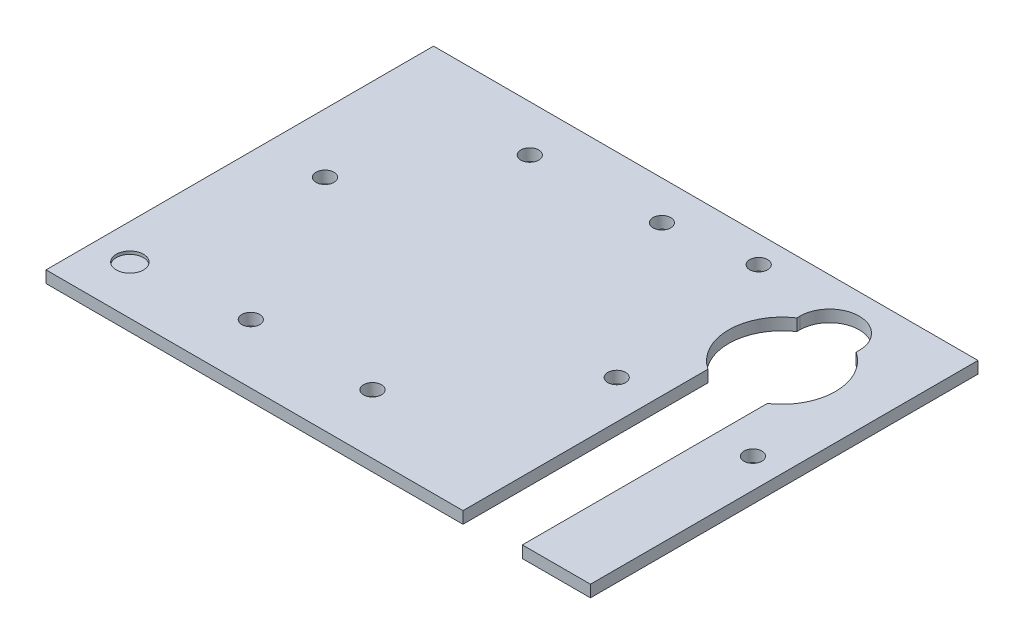
ISO-10303-21;
HEADER;
FILE_DESCRIPTION(('STEP AP214'),'2;1');
FILE_NAME('part.step','',(''),(''),'','','');
FILE_SCHEMA(('AUTOMOTIVE_DESIGN { 1 0 10303 214 1 1 1 1 }'));
ENDSEC;
DATA;
#1=APPLICATION_CONTEXT('core data for automotive mechanical design processes');
#2=APPLICATION_PROTOCOL_DEFINITION('international standard','automotive_design',2000,#1);
#3=PRODUCT_CONTEXT('',#1,'mechanical');
#4=PRODUCT('Part','Part','',(#3));
#5=PRODUCT_RELATED_PRODUCT_CATEGORY('part','',(#4));
#6=PRODUCT_DEFINITION_FORMATION('','',#4);
#7=PRODUCT_DEFINITION_CONTEXT('part definition',#1,'design');
#8=PRODUCT_DEFINITION('design','',#6,#7);
#9=PRODUCT_DEFINITION_SHAPE('','',#8);
#10=(LENGTH_UNIT() NAMED_UNIT(*) SI_UNIT(.MILLI.,.METRE.));
#11=(NAMED_UNIT(*) PLANE_ANGLE_UNIT() SI_UNIT($,.RADIAN.));
#12=(NAMED_UNIT(*) SI_UNIT($,.STERADIAN.) SOLID_ANGLE_UNIT());
#13=UNCERTAINTY_MEASURE_WITH_UNIT(LENGTH_MEASURE(1.E-05),#10,'distance_accuracy_value','');
#14=(GEOMETRIC_REPRESENTATION_CONTEXT(3) GLOBAL_UNCERTAINTY_ASSIGNED_CONTEXT((#13)) GLOBAL_UNIT_ASSIGNED_CONTEXT((#10,
#11,#12)) REPRESENTATION_CONTEXT('',''));
#15=CARTESIAN_POINT('',(0.,0.,0.));
#16=DIRECTION('',(0.,0.,1.));
#17=DIRECTION('',(1.,0.,0.));
#18=AXIS2_PLACEMENT_3D('',#15,#16,#17);
#19=CARTESIAN_POINT('',(184.512742249768,85.7958597408411,32.9410488586266));
#20=DIRECTION('',(0.,1.,0.));
#21=DIRECTION('',(-1.,0.,0.));
#22=AXIS2_PLACEMENT_3D('',#19,#20,#21);
#23=CYLINDRICAL_SURFACE('',#22,9.00000000000001);
#24=CARTESIAN_POINT('',(184.512742249768,87.7958597408411,32.9410488586266));
#25=DIRECTION('',(0.,-1.,0.));
#26=DIRECTION('',(1.,0.,0.));
#27=AXIS2_PLACEMENT_3D('',#24,#25,#26);
#28=CIRCLE('',#27,9.00000000000001);
#29=CARTESIAN_POINT('',(179.512742249767,87.7958597408411,40.4243636321745));
#30=VERTEX_POINT('',#29);
#31=CARTESIAN_POINT('',(179.512742249768,87.7958597408412,25.4577340850787));
#32=VERTEX_POINT('',#31);
#33=EDGE_CURVE('E178',#30,#32,#28,.T.);
#34=ORIENTED_EDGE('',*,*,#33,.F.);
#35=DIRECTION('',(0.,1.,0.));
#36=VECTOR('',#35,1.);
#37=CARTESIAN_POINT('',(179.512742249767,85.7958597408411,40.4243636321745));
#38=LINE('',#37,#36);
#39=CARTESIAN_POINT('',(179.512742249767,85.7958597408411,40.4243636321745));
#40=VERTEX_POINT('',#39);
#41=EDGE_CURVE('E11',#40,#30,#38,.T.);
#42=ORIENTED_EDGE('',*,*,#41,.F.);
#43=CARTESIAN_POINT('',(184.512742249768,85.7958597408411,32.9410488586266));
#44=DIRECTION('',(0.,-1.,0.));
#45=DIRECTION('',(1.,0.,0.));
#46=AXIS2_PLACEMENT_3D('',#43,#44,#45);
#47=CIRCLE('',#46,9.00000000000001);
#48=CARTESIAN_POINT('',(179.512742249768,85.7958597408412,25.4577340850787));
#49=VERTEX_POINT('',#48);
#50=EDGE_CURVE('E230',#40,#49,#47,.T.);
#51=ORIENTED_EDGE('',*,*,#50,.T.);
#52=DIRECTION('',(0.,1.,0.));
#53=VECTOR('',#52,1.);
#54=CARTESIAN_POINT('',(179.512742249768,85.7958597408412,25.4577340850787));
#55=LINE('',#54,#53);
#56=EDGE_CURVE('E51',#49,#32,#55,.T.);
#57=ORIENTED_EDGE('',*,*,#56,.T.);
#58=EDGE_LOOP('',(#34,#42,#51,#57));
#59=FACE_BOUND('',#58,.T.);
#60=ADVANCED_FACE('F34',(#59),#23,.F.);
#61=CARTESIAN_POINT('',(179.512742249767,85.7958597408413,3.02659567375586E-13));
#62=DIRECTION('',(-1.,0.,0.));
#63=DIRECTION('',(0.,-1.,0.));
#64=AXIS2_PLACEMENT_3D('',#61,#62,#63);
#65=PLANE('',#64);
#66=DIRECTION('',(0.,0.,1.));
#67=VECTOR('',#66,1.);
#68=CARTESIAN_POINT('',(179.512742249767,87.7958597408413,3.09642530053273E-13));
#69=LINE('',#68,#67);
#70=CARTESIAN_POINT('',(179.512742249767,87.795859740841,81.6910488586266));
#71=VERTEX_POINT('',#70);
#72=EDGE_CURVE('E180',#30,#71,#69,.T.);
#73=ORIENTED_EDGE('',*,*,#72,.T.);
#74=DIRECTION('',(0.,1.,0.));
#75=VECTOR('',#74,1.);
#76=CARTESIAN_POINT('',(179.512742249767,85.795859740841,81.6910488586266));
#77=LINE('',#76,#75);
#78=CARTESIAN_POINT('',(179.512742249767,85.795859740841,81.6910488586266));
#79=VERTEX_POINT('',#78);
#80=EDGE_CURVE('E43',#79,#71,#77,.T.);
#81=ORIENTED_EDGE('',*,*,#80,.F.);
#82=DIRECTION('',(0.,0.,1.));
#83=VECTOR('',#82,1.);
#84=CARTESIAN_POINT('',(179.512742249767,85.7958597408413,3.02659567375586E-13));
#85=LINE('',#84,#83);
#86=EDGE_CURVE('E286',#40,#79,#85,.T.);
#87=ORIENTED_EDGE('',*,*,#86,.F.);
#88=ORIENTED_EDGE('',*,*,#41,.T.);
#89=EDGE_LOOP('',(#73,#81,#87,#88));
#90=FACE_BOUND('',#89,.T.);
#91=ADVANCED_FACE('F36',(#90),#65,.F.);
#92=CARTESIAN_POINT('',(5.92933433549048E-13,85.7958597408422,81.6910488586266));
#93=DIRECTION('',(0.,0.,1.));
#94=DIRECTION('',(0.,-1.,0.));
#95=AXIS2_PLACEMENT_3D('',#92,#93,#94);
#96=PLANE('',#95);
#97=DIRECTION('',(1.,0.,0.));
#98=VECTOR('',#97,1.);
#99=CARTESIAN_POINT('',(6.06899358904421E-13,87.7958597408422,81.6910488586266));
#100=LINE('',#99,#98);
#101=CARTESIAN_POINT('',(109.262742249768,87.7958597408415,81.6910488586266));
#102=VERTEX_POINT('',#101);
#103=EDGE_CURVE('E185',#102,#71,#100,.T.);
#104=ORIENTED_EDGE('',*,*,#103,.F.);
#105=DIRECTION('',(0.,1.,0.));
#106=VECTOR('',#105,1.);
#107=CARTESIAN_POINT('',(109.262742249768,85.7958597408415,81.6910488586266));
#108=LINE('',#107,#106);
#109=CARTESIAN_POINT('',(109.262742249768,85.7958597408415,81.6910488586266));
#110=VERTEX_POINT('',#109);
#111=EDGE_CURVE('E245',#110,#102,#108,.T.);
#112=ORIENTED_EDGE('',*,*,#111,.F.);
#113=DIRECTION('',(1.,0.,0.));
#114=VECTOR('',#113,1.);
#115=CARTESIAN_POINT('',(5.92933433549048E-13,85.7958597408422,81.6910488586266));
#116=LINE('',#115,#114);
#117=EDGE_CURVE('E252',#110,#79,#116,.T.);
#118=ORIENTED_EDGE('',*,*,#117,.T.);
#119=ORIENTED_EDGE('',*,*,#80,.T.);
#120=EDGE_LOOP('',(#104,#112,#118,#119));
#121=FACE_BOUND('',#120,.T.);
#122=ADVANCED_FACE('F250',(#121),#96,.T.);
#123=CARTESIAN_POINT('',(109.262742249768,85.7958597408418,3.25885345854192E-13));
#124=DIRECTION('',(1.,0.,0.));
#125=DIRECTION('',(0.,1.,0.));
#126=AXIS2_PLACEMENT_3D('',#123,#124,#125);
#127=PLANE('',#126);
#128=DIRECTION('',(0.,0.,-1.));
#129=VECTOR('',#128,1.);
#130=CARTESIAN_POINT('',(109.262742249768,87.7958597408418,3.32868308531879E-13));
#131=LINE('',#130,#129);
#132=CARTESIAN_POINT('',(109.262742249768,87.7958597408417,16.4047483955857));
#133=VERTEX_POINT('',#132);
#134=EDGE_CURVE('E188',#102,#133,#131,.T.);
#135=ORIENTED_EDGE('',*,*,#134,.T.);
#136=DIRECTION('',(0.,1.,0.));
#137=VECTOR('',#136,1.);
#138=CARTESIAN_POINT('',(109.262742249768,85.7958597408417,16.4047483955857));
#139=LINE('',#138,#137);
#140=CARTESIAN_POINT('',(109.262742249768,85.7958597408417,16.4047483955857));
#141=VERTEX_POINT('',#140);
#142=EDGE_CURVE('E242',#141,#133,#139,.T.);
#143=ORIENTED_EDGE('',*,*,#142,.F.);
#144=DIRECTION('',(0.,0.,-1.));
#145=VECTOR('',#144,1.);
#146=CARTESIAN_POINT('',(109.262742249768,85.7958597408418,3.25885345854192E-13));
#147=LINE('',#146,#145);
#148=EDGE_CURVE('E272',#110,#141,#147,.T.);
#149=ORIENTED_EDGE('',*,*,#148,.F.);
#150=ORIENTED_EDGE('',*,*,#111,.T.);
#151=EDGE_LOOP('',(#135,#143,#149,#150));
#152=FACE_BOUND('',#151,.T.);
#153=ADVANCED_FACE('F262',(#152),#127,.F.);
#154=CARTESIAN_POINT('',(5.9293343354905E-13,85.7958597408425,16.4047483955857));
#155=DIRECTION('',(0.,0.,1.));
#156=DIRECTION('',(0.,-1.,0.));
#157=AXIS2_PLACEMENT_3D('',#154,#155,#156);
#158=PLANE('',#157);
#159=DIRECTION('',(1.,0.,0.));
#160=VECTOR('',#159,1.);
#161=CARTESIAN_POINT('',(6.06899358904422E-13,87.7958597408425,16.4047483955857));
#162=LINE('',#161,#160);
#163=CARTESIAN_POINT('',(200.984270976789,87.7958597408411,16.4047483955857));
#164=VERTEX_POINT('',#163);
#165=EDGE_CURVE('E191',#133,#164,#162,.T.);
#166=ORIENTED_EDGE('',*,*,#165,.T.);
#167=DIRECTION('',(0.,1.,0.));
#168=VECTOR('',#167,1.);
#169=CARTESIAN_POINT('',(200.984270976788,85.7958597408411,16.4047483955857));
#170=LINE('',#169,#168);
#171=CARTESIAN_POINT('',(200.984270976788,85.7958597408411,16.4047483955857));
#172=VERTEX_POINT('',#171);
#173=EDGE_CURVE('E240',#172,#164,#170,.T.);
#174=ORIENTED_EDGE('',*,*,#173,.F.);
#175=DIRECTION('',(1.,0.,0.));
#176=VECTOR('',#175,1.);
#177=CARTESIAN_POINT('',(5.9293343354905E-13,85.7958597408425,16.4047483955857));
#178=LINE('',#177,#176);
#179=EDGE_CURVE('E268',#141,#172,#178,.T.);
#180=ORIENTED_EDGE('',*,*,#179,.F.);
#181=ORIENTED_EDGE('',*,*,#142,.T.);
#182=EDGE_LOOP('',(#166,#174,#180,#181));
#183=FACE_BOUND('',#182,.T.);
#184=ADVANCED_FACE('F266',(#183),#158,.F.);
#185=CARTESIAN_POINT('',(200.984270976788,85.7958597408411,3.02659567375586E-13));
#186=DIRECTION('',(1.,0.,0.));
#187=DIRECTION('',(0.,1.,0.));
#188=AXIS2_PLACEMENT_3D('',#185,#186,#187);
#189=PLANE('',#188);
#190=DIRECTION('',(0.,0.,-1.));
#191=VECTOR('',#190,1.);
#192=CARTESIAN_POINT('',(200.984270976789,87.7958597408411,3.09642530053272E-13));
#193=LINE('',#192,#191);
#194=CARTESIAN_POINT('',(200.984270976789,87.7958597408408,81.6910488586266));
#195=VERTEX_POINT('',#194);
#196=EDGE_CURVE('E194',#195,#164,#193,.T.);
#197=ORIENTED_EDGE('',*,*,#196,.F.);
#198=DIRECTION('',(0.,1.,0.));
#199=VECTOR('',#198,1.);
#200=CARTESIAN_POINT('',(200.984270976788,85.7958597408408,81.6910488586266));
#201=LINE('',#200,#199);
#202=CARTESIAN_POINT('',(200.984270976788,85.7958597408408,81.6910488586266));
#203=VERTEX_POINT('',#202);
#204=EDGE_CURVE('E238',#203,#195,#201,.T.);
#205=ORIENTED_EDGE('',*,*,#204,.F.);
#206=DIRECTION('',(0.,0.,-1.));
#207=VECTOR('',#206,1.);
#208=CARTESIAN_POINT('',(200.984270976788,85.7958597408411,3.02659567375586E-13));
#209=LINE('',#208,#207);
#210=EDGE_CURVE('E271',#203,#172,#209,.T.);
#211=ORIENTED_EDGE('',*,*,#210,.T.);
#212=ORIENTED_EDGE('',*,*,#173,.T.);
#213=EDGE_LOOP('',(#197,#205,#211,#212));
#214=FACE_BOUND('',#213,.T.);
#215=ADVANCED_FACE('F463',(#214),#189,.T.);
#216=CARTESIAN_POINT('',(189.512742249768,87.7958597408409,81.6910488586266));
#217=VERTEX_POINT('',#216);
#218=EDGE_CURVE('E189',#217,#195,#100,.T.);
#219=ORIENTED_EDGE('',*,*,#218,.F.);
#220=DIRECTION('',(0.,1.,0.));
#221=VECTOR('',#220,1.);
#222=CARTESIAN_POINT('',(189.512742249768,85.7958597408409,81.6910488586266));
#223=LINE('',#222,#221);
#224=CARTESIAN_POINT('',(189.512742249768,85.7958597408409,81.6910488586266));
#225=VERTEX_POINT('',#224);
#226=EDGE_CURVE('E236',#225,#217,#223,.T.);
#227=ORIENTED_EDGE('',*,*,#226,.F.);
#228=EDGE_CURVE('E274',#225,#203,#116,.T.);
#229=ORIENTED_EDGE('',*,*,#228,.T.);
#230=ORIENTED_EDGE('',*,*,#204,.T.);
#231=EDGE_LOOP('',(#219,#227,#229,#230));
#232=FACE_BOUND('',#231,.T.);
#233=ADVANCED_FACE('F325',(#232),#96,.T.);
#234=CARTESIAN_POINT('',(189.512742249768,85.7958597408412,3.02659567375586E-13));
#235=DIRECTION('',(-1.,0.,0.));
#236=DIRECTION('',(0.,-1.,0.));
#237=AXIS2_PLACEMENT_3D('',#234,#235,#236);
#238=PLANE('',#237);
#239=DIRECTION('',(0.,0.,1.));
#240=VECTOR('',#239,1.);
#241=CARTESIAN_POINT('',(189.512742249768,87.7958597408412,3.09642530053272E-13));
#242=LINE('',#241,#240);
#243=CARTESIAN_POINT('',(189.512742249768,87.7958597408411,40.4243636321745));
#244=VERTEX_POINT('',#243);
#245=EDGE_CURVE('E197',#244,#217,#242,.T.);
#246=ORIENTED_EDGE('',*,*,#245,.F.);
#247=DIRECTION('',(0.,1.,0.));
#248=VECTOR('',#247,1.);
#249=CARTESIAN_POINT('',(189.512742249768,85.7958597408411,40.4243636321745));
#250=LINE('',#249,#248);
#251=CARTESIAN_POINT('',(189.512742249768,85.7958597408411,40.4243636321745));
#252=VERTEX_POINT('',#251);
#253=EDGE_CURVE('E234',#252,#244,#250,.T.);
#254=ORIENTED_EDGE('',*,*,#253,.F.);
#255=DIRECTION('',(0.,0.,1.));
#256=VECTOR('',#255,1.);
#257=CARTESIAN_POINT('',(189.512742249768,85.7958597408412,3.02659567375586E-13));
#258=LINE('',#257,#256);
#259=EDGE_CURVE('E278',#252,#225,#258,.T.);
#260=ORIENTED_EDGE('',*,*,#259,.T.);
#261=ORIENTED_EDGE('',*,*,#226,.T.);
#262=EDGE_LOOP('',(#246,#254,#260,#261));
#263=FACE_BOUND('',#262,.T.);
#264=ADVANCED_FACE('F319',(#263),#238,.T.);
#265=CARTESIAN_POINT('',(189.512742249767,87.7958597408411,25.4577340850787));
#266=VERTEX_POINT('',#265);
#267=EDGE_CURVE('E182',#266,#244,#28,.T.);
#268=ORIENTED_EDGE('',*,*,#267,.F.);
#269=DIRECTION('',(0.,1.,0.));
#270=VECTOR('',#269,1.);
#271=CARTESIAN_POINT('',(189.512742249767,85.7958597408411,25.4577340850787));
#272=LINE('',#271,#270);
#273=CARTESIAN_POINT('',(189.512742249767,85.7958597408411,25.4577340850787));
#274=VERTEX_POINT('',#273);
#275=EDGE_CURVE('E146',#274,#266,#272,.T.);
#276=ORIENTED_EDGE('',*,*,#275,.F.);
#277=EDGE_CURVE('E136',#274,#252,#47,.T.);
#278=ORIENTED_EDGE('',*,*,#277,.T.);
#279=ORIENTED_EDGE('',*,*,#253,.T.);
#280=EDGE_LOOP('',(#268,#276,#278,#279));
#281=FACE_BOUND('',#280,.T.);
#282=ADVANCED_FACE('F312',(#281),#23,.F.);
#283=CARTESIAN_POINT('',(189.512742249767,85.7958597408412,3.02659567375586E-13));
#284=DIRECTION('',(1.,0.,0.));
#285=DIRECTION('',(0.,1.,0.));
#286=AXIS2_PLACEMENT_3D('',#283,#284,#285);
#287=PLANE('',#286);
#288=DIRECTION('',(0.,0.,-1.));
#289=VECTOR('',#288,1.);
#290=CARTESIAN_POINT('',(189.512742249767,87.7958597408412,3.09642530053272E-13));
#291=LINE('',#290,#289);
#292=CARTESIAN_POINT('',(189.512742249767,87.7958597408411,24.9410488586266));
#293=VERTEX_POINT('',#292);
#294=EDGE_CURVE('E143',#266,#293,#291,.T.);
#295=ORIENTED_EDGE('',*,*,#294,.T.);
#296=DIRECTION('',(0.,1.,0.));
#297=VECTOR('',#296,1.);
#298=CARTESIAN_POINT('',(189.512742249767,85.7958597408411,24.9410488586266));
#299=LINE('',#298,#297);
#300=CARTESIAN_POINT('',(189.512742249767,85.7958597408411,24.9410488586266));
#301=VERTEX_POINT('',#300);
#302=EDGE_CURVE('E140',#301,#293,#299,.T.);
#303=ORIENTED_EDGE('',*,*,#302,.F.);
#304=DIRECTION('',(0.,0.,-1.));
#305=VECTOR('',#304,1.);
#306=CARTESIAN_POINT('',(189.512742249767,85.7958597408412,3.02659567375586E-13));
#307=LINE('',#306,#305);
#308=EDGE_CURVE('E126',#274,#301,#307,.T.);
#309=ORIENTED_EDGE('',*,*,#308,.F.);
#310=ORIENTED_EDGE('',*,*,#275,.T.);
#311=EDGE_LOOP('',(#295,#303,#309,#310));
#312=FACE_BOUND('',#311,.T.);
#313=ADVANCED_FACE('F141',(#312),#287,.F.);
#314=CARTESIAN_POINT('',(184.512742249768,85.7958597408412,24.9410488586266));
#315=DIRECTION('',(0.,1.,0.));
#316=DIRECTION('',(-1.,0.,0.));
#317=AXIS2_PLACEMENT_3D('',#314,#315,#316);
#318=CYLINDRICAL_SURFACE('',#317,4.99999999999998);
#319=CARTESIAN_POINT('',(184.512742249768,87.7958597408412,24.9410488586266));
#320=DIRECTION('',(0.,-1.,0.));
#321=DIRECTION('',(1.,0.,0.));
#322=AXIS2_PLACEMENT_3D('',#319,#320,#321);
#323=CIRCLE('',#322,4.99999999999998);
#324=CARTESIAN_POINT('',(179.512742249768,87.7958597408412,24.9410488586266));
#325=VERTEX_POINT('',#324);
#326=EDGE_CURVE('E201',#325,#293,#323,.T.);
#327=ORIENTED_EDGE('',*,*,#326,.F.);
#328=DIRECTION('',(0.,1.,0.));
#329=VECTOR('',#328,1.);
#330=CARTESIAN_POINT('',(179.512742249768,85.7958597408412,24.9410488586266));
#331=LINE('',#330,#329);
#332=CARTESIAN_POINT('',(179.512742249768,85.7958597408412,24.9410488586266));
#333=VERTEX_POINT('',#332);
#334=EDGE_CURVE('E88',#333,#325,#331,.T.);
#335=ORIENTED_EDGE('',*,*,#334,.F.);
#336=CARTESIAN_POINT('',(184.512742249768,85.7958597408412,24.9410488586266));
#337=DIRECTION('',(0.,-1.,0.));
#338=DIRECTION('',(1.,0.,0.));
#339=AXIS2_PLACEMENT_3D('',#336,#337,#338);
#340=CIRCLE('',#339,4.99999999999998);
#341=EDGE_CURVE('E133',#333,#301,#340,.T.);
#342=ORIENTED_EDGE('',*,*,#341,.T.);
#343=ORIENTED_EDGE('',*,*,#302,.T.);
#344=EDGE_LOOP('',(#327,#335,#342,#343));
#345=FACE_BOUND('',#344,.T.);
#346=ADVANCED_FACE('F148',(#345),#318,.F.);
#347=CARTESIAN_POINT('',(154.262742249768,85.7958597408412,71.6910488586266));
#348=DIRECTION('',(0.,1.,0.));
#349=DIRECTION('',(-1.,0.,0.));
#350=AXIS2_PLACEMENT_3D('',#347,#348,#349);
#351=CYLINDRICAL_SURFACE('',#350,1.5);
#352=CARTESIAN_POINT('',(154.262742249768,85.7958597408412,71.6910488586266));
#353=DIRECTION('',(0.,-1.,0.));
#354=DIRECTION('',(1.,0.,0.));
#355=AXIS2_PLACEMENT_3D('',#352,#353,#354);
#356=CIRCLE('',#355,1.5);
#357=CARTESIAN_POINT('',(155.762742249768,85.7958597408412,71.6910488586266));
#358=VERTEX_POINT('',#357);
#359=EDGE_CURVE('E172',#358,#358,#356,.T.);
#360=ORIENTED_EDGE('',*,*,#359,.T.);
#361=EDGE_LOOP('',(#360));
#362=FACE_BOUND('',#361,.T.);
#363=CARTESIAN_POINT('',(154.262742249768,87.7958597408412,71.6910488586266));
#364=DIRECTION('',(0.,-1.,0.));
#365=DIRECTION('',(1.,0.,0.));
#366=AXIS2_PLACEMENT_3D('',#363,#364,#365);
#367=CIRCLE('',#366,1.5);
#368=CARTESIAN_POINT('',(155.762742249768,87.7958597408412,71.6910488586266));
#369=VERTEX_POINT('',#368);
#370=EDGE_CURVE('E224',#369,#369,#367,.T.);
#371=ORIENTED_EDGE('',*,*,#370,.F.);
#372=EDGE_LOOP('',(#371));
#373=FACE_BOUND('',#372,.T.);
#374=ADVANCED_FACE('F345',(#362,#373),#351,.F.);
#375=CARTESIAN_POINT('',(133.262742249768,85.7958597408415,24.1910488586278));
#376=DIRECTION('',(0.,1.,0.));
#377=DIRECTION('',(-1.,0.,0.));
#378=AXIS2_PLACEMENT_3D('',#375,#376,#377);
#379=CYLINDRICAL_SURFACE('',#378,1.5);
#380=CARTESIAN_POINT('',(133.262742249768,85.7958597408415,24.1910488586278));
#381=DIRECTION('',(0.,-1.,0.));
#382=DIRECTION('',(1.,0.,0.));
#383=AXIS2_PLACEMENT_3D('',#380,#381,#382);
#384=CIRCLE('',#383,1.5);
#385=CARTESIAN_POINT('',(134.762742249768,85.7958597408415,24.1910488586278));
#386=VERTEX_POINT('',#385);
#387=EDGE_CURVE('E169',#386,#386,#384,.T.);
#388=ORIENTED_EDGE('',*,*,#387,.T.);
#389=EDGE_LOOP('',(#388));
#390=FACE_BOUND('',#389,.T.);
#391=CARTESIAN_POINT('',(133.262742249768,87.7958597408415,24.1910488586278));
#392=DIRECTION('',(0.,-1.,0.));
#393=DIRECTION('',(1.,0.,0.));
#394=AXIS2_PLACEMENT_3D('',#391,#392,#393);
#395=CIRCLE('',#394,1.5);
#396=CARTESIAN_POINT('',(134.762742249768,87.7958597408415,24.1910488586278));
#397=VERTEX_POINT('',#396);
#398=EDGE_CURVE('E221',#397,#397,#395,.T.);
#399=ORIENTED_EDGE('',*,*,#398,.F.);
#400=EDGE_LOOP('',(#399));
#401=FACE_BOUND('',#400,.T.);
#402=ADVANCED_FACE('F349',(#390,#401),#379,.F.);
#403=CARTESIAN_POINT('',(119.262742249768,85.7958597408415,44.6910488586277));
#404=DIRECTION('',(0.,1.,0.));
#405=DIRECTION('',(-1.,0.,0.));
#406=AXIS2_PLACEMENT_3D('',#403,#404,#405);
#407=CYLINDRICAL_SURFACE('',#406,1.5);
#408=CARTESIAN_POINT('',(119.262742249768,85.7958597408415,44.6910488586277));
#409=DIRECTION('',(0.,-1.,0.));
#410=DIRECTION('',(1.,0.,0.));
#411=AXIS2_PLACEMENT_3D('',#408,#409,#410);
#412=CIRCLE('',#411,1.5);
#413=CARTESIAN_POINT('',(120.762742249768,85.7958597408415,44.6910488586277));
#414=VERTEX_POINT('',#413);
#415=EDGE_CURVE('E166',#414,#414,#412,.T.);
#416=ORIENTED_EDGE('',*,*,#415,.T.);
#417=EDGE_LOOP('',(#416));
#418=FACE_BOUND('',#417,.T.);
#419=CARTESIAN_POINT('',(119.262742249768,87.7958597408415,44.6910488586277));
#420=DIRECTION('',(0.,-1.,0.));
#421=DIRECTION('',(1.,0.,0.));
#422=AXIS2_PLACEMENT_3D('',#419,#420,#421);
#423=CIRCLE('',#422,1.5);
#424=CARTESIAN_POINT('',(120.762742249768,87.7958597408415,44.6910488586277));
#425=VERTEX_POINT('',#424);
#426=EDGE_CURVE('E218',#425,#425,#423,.T.);
#427=ORIENTED_EDGE('',*,*,#426,.F.);
#428=EDGE_LOOP('',(#427));
#429=FACE_BOUND('',#428,.T.);
#430=ADVANCED_FACE('F355',(#418,#429),#407,.F.);
#431=CARTESIAN_POINT('',(154.262742249768,85.7958597408414,22.941048858626));
#432=DIRECTION('',(0.,1.,0.));
#433=DIRECTION('',(-1.,0.,0.));
#434=AXIS2_PLACEMENT_3D('',#431,#432,#433);
#435=CYLINDRICAL_SURFACE('',#434,1.5);
#436=CARTESIAN_POINT('',(154.262742249768,85.7958597408414,22.941048858626));
#437=DIRECTION('',(0.,-1.,0.));
#438=DIRECTION('',(1.,0.,0.));
#439=AXIS2_PLACEMENT_3D('',#436,#437,#438);
#440=CIRCLE('',#439,1.5);
#441=CARTESIAN_POINT('',(155.762742249768,85.7958597408414,22.941048858626));
#442=VERTEX_POINT('',#441);
#443=EDGE_CURVE('E163',#442,#442,#440,.T.);
#444=ORIENTED_EDGE('',*,*,#443,.T.);
#445=EDGE_LOOP('',(#444));
#446=FACE_BOUND('',#445,.T.);
#447=CARTESIAN_POINT('',(154.262742249768,87.7958597408414,22.9410488586261));
#448=DIRECTION('',(0.,-1.,0.));
#449=DIRECTION('',(1.,0.,0.));
#450=AXIS2_PLACEMENT_3D('',#447,#448,#449);
#451=CIRCLE('',#450,1.5);
#452=CARTESIAN_POINT('',(155.762742249768,87.7958597408414,22.9410488586261));
#453=VERTEX_POINT('',#452);
#454=EDGE_CURVE('E215',#453,#453,#451,.T.);
#455=ORIENTED_EDGE('',*,*,#454,.F.);
#456=EDGE_LOOP('',(#455));
#457=FACE_BOUND('',#456,.T.);
#458=ADVANCED_FACE('F362',(#446,#457),#435,.F.);
#459=CARTESIAN_POINT('',(168.540032048822,85.7958597408413,20.9047483955857));
#460=DIRECTION('',(0.,1.,0.));
#461=DIRECTION('',(-1.,0.,0.));
#462=AXIS2_PLACEMENT_3D('',#459,#460,#461);
#463=CYLINDRICAL_SURFACE('',#462,1.5);
#464=CARTESIAN_POINT('',(168.540032048822,85.7958597408413,20.9047483955857));
#465=DIRECTION('',(0.,-1.,0.));
#466=DIRECTION('',(1.,0.,0.));
#467=AXIS2_PLACEMENT_3D('',#464,#465,#466);
#468=CIRCLE('',#467,1.5);
#469=CARTESIAN_POINT('',(170.040032048822,85.7958597408413,20.9047483955857));
#470=VERTEX_POINT('',#469);
#471=EDGE_CURVE('E160',#470,#470,#468,.T.);
#472=ORIENTED_EDGE('',*,*,#471,.T.);
#473=EDGE_LOOP('',(#472));
#474=FACE_BOUND('',#473,.T.);
#475=CARTESIAN_POINT('',(168.540032048822,87.7958597408413,20.9047483955857));
#476=DIRECTION('',(0.,-1.,0.));
#477=DIRECTION('',(1.,0.,0.));
#478=AXIS2_PLACEMENT_3D('',#475,#476,#477);
#479=CIRCLE('',#478,1.5);
#480=CARTESIAN_POINT('',(170.040032048822,87.7958597408413,20.9047483955857));
#481=VERTEX_POINT('',#480);
#482=EDGE_CURVE('E212',#481,#481,#479,.T.);
#483=ORIENTED_EDGE('',*,*,#482,.F.);
#484=EDGE_LOOP('',(#483));
#485=FACE_BOUND('',#484,.T.);
#486=ADVANCED_FACE('F366',(#474,#485),#463,.F.);
#487=CARTESIAN_POINT('',(195.984270976788,85.795859740841,49.3240897444064));
#488=DIRECTION('',(0.,1.,0.));
#489=DIRECTION('',(-1.,0.,0.));
#490=AXIS2_PLACEMENT_3D('',#487,#488,#489);
#491=CYLINDRICAL_SURFACE('',#490,1.5);
#492=CARTESIAN_POINT('',(195.984270976788,85.795859740841,49.3240897444064));
#493=DIRECTION('',(0.,-1.,0.));
#494=DIRECTION('',(1.,0.,0.));
#495=AXIS2_PLACEMENT_3D('',#492,#493,#494);
#496=CIRCLE('',#495,1.5);
#497=CARTESIAN_POINT('',(197.484270976788,85.795859740841,49.3240897444064));
#498=VERTEX_POINT('',#497);
#499=EDGE_CURVE('E157',#498,#498,#496,.T.);
#500=ORIENTED_EDGE('',*,*,#499,.T.);
#501=EDGE_LOOP('',(#500));
#502=FACE_BOUND('',#501,.T.);
#503=CARTESIAN_POINT('',(195.984270976789,87.795859740841,49.3240897444064));
#504=DIRECTION('',(0.,-1.,0.));
#505=DIRECTION('',(1.,0.,0.));
#506=AXIS2_PLACEMENT_3D('',#503,#504,#505);
#507=CIRCLE('',#506,1.5);
#508=CARTESIAN_POINT('',(197.484270976789,87.795859740841,49.3240897444064));
#509=VERTEX_POINT('',#508);
#510=EDGE_CURVE('E209',#509,#509,#507,.T.);
#511=ORIENTED_EDGE('',*,*,#510,.F.);
#512=EDGE_LOOP('',(#511));
#513=FACE_BOUND('',#512,.T.);
#514=ADVANCED_FACE('F339',(#502,#513),#491,.F.);
#515=CARTESIAN_POINT('',(173.041213522747,85.7958597408411,49.3240897444064));
#516=DIRECTION('',(0.,1.,0.));
#517=DIRECTION('',(-1.,0.,0.));
#518=AXIS2_PLACEMENT_3D('',#515,#516,#517);
#519=CYLINDRICAL_SURFACE('',#518,1.5);
#520=CARTESIAN_POINT('',(173.041213522747,85.7958597408411,49.3240897444064));
#521=DIRECTION('',(0.,-1.,0.));
#522=DIRECTION('',(1.,0.,0.));
#523=AXIS2_PLACEMENT_3D('',#520,#521,#522);
#524=CIRCLE('',#523,1.5);
#525=CARTESIAN_POINT('',(174.541213522747,85.7958597408411,49.3240897444064));
#526=VERTEX_POINT('',#525);
#527=EDGE_CURVE('E151',#526,#526,#524,.T.);
#528=ORIENTED_EDGE('',*,*,#527,.T.);
#529=EDGE_LOOP('',(#528));
#530=FACE_BOUND('',#529,.T.);
#531=CARTESIAN_POINT('',(173.041213522747,87.7958597408411,49.3240897444064));
#532=DIRECTION('',(0.,-1.,0.));
#533=DIRECTION('',(1.,0.,0.));
#534=AXIS2_PLACEMENT_3D('',#531,#532,#533);
#535=CIRCLE('',#534,1.5);
#536=CARTESIAN_POINT('',(174.541213522747,87.7958597408411,49.3240897444064));
#537=VERTEX_POINT('',#536);
#538=EDGE_CURVE('E206',#537,#537,#535,.T.);
#539=ORIENTED_EDGE('',*,*,#538,.F.);
#540=EDGE_LOOP('',(#539));
#541=FACE_BOUND('',#540,.T.);
#542=ADVANCED_FACE('F332',(#530,#541),#519,.F.);
#543=CARTESIAN_POINT('',(179.512742249768,85.7958597408413,3.02659567375586E-13));
#544=DIRECTION('',(1.,0.,0.));
#545=DIRECTION('',(0.,1.,0.));
#546=AXIS2_PLACEMENT_3D('',#543,#544,#545);
#547=PLANE('',#546);
#548=DIRECTION('',(0.,0.,-1.));
#549=VECTOR('',#548,1.);
#550=CARTESIAN_POINT('',(179.512742249768,87.7958597408413,3.09642530053273E-13));
#551=LINE('',#550,#549);
#552=EDGE_CURVE('E203',#32,#325,#551,.T.);
#553=ORIENTED_EDGE('',*,*,#552,.F.);
#554=ORIENTED_EDGE('',*,*,#56,.F.);
#555=DIRECTION('',(0.,0.,-1.));
#556=VECTOR('',#555,1.);
#557=CARTESIAN_POINT('',(179.512742249768,85.7958597408413,3.02659567375586E-13));
#558=LINE('',#557,#556);
#559=EDGE_CURVE('E149',#49,#333,#558,.T.);
#560=ORIENTED_EDGE('',*,*,#559,.T.);
#561=ORIENTED_EDGE('',*,*,#334,.T.);
#562=EDGE_LOOP('',(#553,#554,#560,#561));
#563=FACE_BOUND('',#562,.T.);
#564=ADVANCED_FACE('F330',(#563),#547,.T.);
#565=CARTESIAN_POINT('',(133.762742249768,85.7958597408413,71.6910488586266));
#566=DIRECTION('',(0.,1.,0.));
#567=DIRECTION('',(-1.,0.,0.));
#568=AXIS2_PLACEMENT_3D('',#565,#566,#567);
#569=CYLINDRICAL_SURFACE('',#568,1.5);
#570=CARTESIAN_POINT('',(133.762742249768,85.7958597408413,71.6910488586266));
#571=DIRECTION('',(0.,-1.,0.));
#572=DIRECTION('',(1.,0.,0.));
#573=AXIS2_PLACEMENT_3D('',#570,#571,#572);
#574=CIRCLE('',#573,1.5);
#575=CARTESIAN_POINT('',(135.262742249768,85.7958597408413,71.6910488586266));
#576=VERTEX_POINT('',#575);
#577=EDGE_CURVE('E175',#576,#576,#574,.T.);
#578=ORIENTED_EDGE('',*,*,#577,.T.);
#579=EDGE_LOOP('',(#578));
#580=FACE_BOUND('',#579,.T.);
#581=CARTESIAN_POINT('',(133.762742249768,87.7958597408413,71.6910488586266));
#582=DIRECTION('',(0.,-1.,0.));
#583=DIRECTION('',(1.,0.,0.));
#584=AXIS2_PLACEMENT_3D('',#581,#582,#583);
#585=CIRCLE('',#584,1.5);
#586=CARTESIAN_POINT('',(135.262742249768,87.7958597408413,71.6910488586266));
#587=VERTEX_POINT('',#586);
#588=EDGE_CURVE('E227',#587,#587,#585,.T.);
#589=ORIENTED_EDGE('',*,*,#588,.F.);
#590=EDGE_LOOP('',(#589));
#591=FACE_BOUND('',#590,.T.);
#592=ADVANCED_FACE('F307',(#580,#591),#569,.F.);
#593=CARTESIAN_POINT('',(5.9293343354905E-13,85.7958597408425,3.02659567375591E-13));
#594=DIRECTION('',(0.,-1.,0.));
#595=DIRECTION('',(1.,0.,0.));
#596=AXIS2_PLACEMENT_3D('',#593,#594,#595);
#597=PLANE('',#596);
#598=ORIENTED_EDGE('',*,*,#50,.F.);
#599=ORIENTED_EDGE('',*,*,#86,.T.);
#600=ORIENTED_EDGE('',*,*,#117,.F.);
#601=ORIENTED_EDGE('',*,*,#148,.T.);
#602=ORIENTED_EDGE('',*,*,#179,.T.);
#603=ORIENTED_EDGE('',*,*,#210,.F.);
#604=ORIENTED_EDGE('',*,*,#228,.F.);
#605=ORIENTED_EDGE('',*,*,#259,.F.);
#606=ORIENTED_EDGE('',*,*,#277,.F.);
#607=ORIENTED_EDGE('',*,*,#308,.T.);
#608=ORIENTED_EDGE('',*,*,#341,.F.);
#609=ORIENTED_EDGE('',*,*,#559,.F.);
#610=EDGE_LOOP('',(#598,#599,#600,#601,#602,#603,#604,#605,#606,#607,#608,#609));
#611=FACE_BOUND('',#610,.T.);
#612=ORIENTED_EDGE('',*,*,#527,.F.);
#613=EDGE_LOOP('',(#612));
#614=FACE_BOUND('',#613,.T.);
#615=ORIENTED_EDGE('',*,*,#499,.F.);
#616=EDGE_LOOP('',(#615));
#617=FACE_BOUND('',#616,.T.);
#618=ORIENTED_EDGE('',*,*,#471,.F.);
#619=EDGE_LOOP('',(#618));
#620=FACE_BOUND('',#619,.T.);
#621=ORIENTED_EDGE('',*,*,#443,.F.);
#622=EDGE_LOOP('',(#621));
#623=FACE_BOUND('',#622,.T.);
#624=ORIENTED_EDGE('',*,*,#415,.F.);
#625=EDGE_LOOP('',(#624));
#626=FACE_BOUND('',#625,.T.);
#627=ORIENTED_EDGE('',*,*,#387,.F.);
#628=EDGE_LOOP('',(#627));
#629=FACE_BOUND('',#628,.T.);
#630=ORIENTED_EDGE('',*,*,#359,.F.);
#631=EDGE_LOOP('',(#630));
#632=FACE_BOUND('',#631,.T.);
#633=ORIENTED_EDGE('',*,*,#577,.F.);
#634=EDGE_LOOP('',(#633));
#635=FACE_BOUND('',#634,.T.);
#636=ADVANCED_FACE('F129',(#611,#614,#617,#620,#623,#626,#629,#632,#635),#597,.T.);
#637=CARTESIAN_POINT('',(6.06899358904423E-13,87.7958597408425,3.09642530053277E-13));
#638=DIRECTION('',(0.,-1.,0.));
#639=DIRECTION('',(1.,0.,0.));
#640=AXIS2_PLACEMENT_3D('',#637,#638,#639);
#641=PLANE('',#640);
#642=CARTESIAN_POINT('',(115.194259531393,87.7958597408415,73.49316382485));
#643=DIRECTION('',(0.,1.,0.));
#644=DIRECTION('',(-1.,0.,0.));
#645=AXIS2_PLACEMENT_3D('',#642,#643,#644);
#646=CIRCLE('',#645,2.29339116465856);
#647=CARTESIAN_POINT('',(112.900868366735,87.7958597408415,73.49316382485));
#648=VERTEX_POINT('',#647);
#649=EDGE_CURVE('E288',#648,#648,#646,.T.);
#650=ORIENTED_EDGE('',*,*,#649,.F.);
#651=EDGE_LOOP('',(#650));
#652=FACE_BOUND('',#651,.T.);
#653=ORIENTED_EDGE('',*,*,#33,.T.);
#654=ORIENTED_EDGE('',*,*,#552,.T.);
#655=ORIENTED_EDGE('',*,*,#326,.T.);
#656=ORIENTED_EDGE('',*,*,#294,.F.);
#657=ORIENTED_EDGE('',*,*,#267,.T.);
#658=ORIENTED_EDGE('',*,*,#245,.T.);
#659=ORIENTED_EDGE('',*,*,#218,.T.);
#660=ORIENTED_EDGE('',*,*,#196,.T.);
#661=ORIENTED_EDGE('',*,*,#165,.F.);
#662=ORIENTED_EDGE('',*,*,#134,.F.);
#663=ORIENTED_EDGE('',*,*,#103,.T.);
#664=ORIENTED_EDGE('',*,*,#72,.F.);
#665=EDGE_LOOP('',(#653,#654,#655,#656,#657,#658,#659,#660,#661,#662,#663,#664));
#666=FACE_BOUND('',#665,.T.);
#667=ORIENTED_EDGE('',*,*,#538,.T.);
#668=EDGE_LOOP('',(#667));
#669=FACE_BOUND('',#668,.T.);
#670=ORIENTED_EDGE('',*,*,#510,.T.);
#671=EDGE_LOOP('',(#670));
#672=FACE_BOUND('',#671,.T.);
#673=ORIENTED_EDGE('',*,*,#482,.T.);
#674=EDGE_LOOP('',(#673));
#675=FACE_BOUND('',#674,.T.);
#676=ORIENTED_EDGE('',*,*,#454,.T.);
#677=EDGE_LOOP('',(#676));
#678=FACE_BOUND('',#677,.T.);
#679=ORIENTED_EDGE('',*,*,#426,.T.);
#680=EDGE_LOOP('',(#679));
#681=FACE_BOUND('',#680,.T.);
#682=ORIENTED_EDGE('',*,*,#398,.T.);
#683=EDGE_LOOP('',(#682));
#684=FACE_BOUND('',#683,.T.);
#685=ORIENTED_EDGE('',*,*,#370,.T.);
#686=EDGE_LOOP('',(#685));
#687=FACE_BOUND('',#686,.T.);
#688=ORIENTED_EDGE('',*,*,#588,.T.);
#689=EDGE_LOOP('',(#688));
#690=FACE_BOUND('',#689,.T.);
#691=ADVANCED_FACE('F257',(#652,#666,#669,#672,#675,#678,#681,#684,#687,#690),#641,.F.);
#692=CARTESIAN_POINT('',(115.194259531393,87.2958597408415,73.49316382485));
#693=DIRECTION('',(0.,1.,0.));
#694=DIRECTION('',(-1.,0.,0.));
#695=AXIS2_PLACEMENT_3D('',#692,#693,#694);
#696=CYLINDRICAL_SURFACE('',#695,2.29339116465856);
#697=CARTESIAN_POINT('',(115.194259531393,87.2958597408415,73.49316382485));
#698=DIRECTION('',(0.,1.,0.));
#699=DIRECTION('',(-1.,0.,0.));
#700=AXIS2_PLACEMENT_3D('',#697,#698,#699);
#701=CIRCLE('',#700,2.29339116465856);
#702=CARTESIAN_POINT('',(112.900868366735,87.2958597408415,73.49316382485));
#703=VERTEX_POINT('',#702);
#704=EDGE_CURVE('E181',#703,#703,#701,.T.);
#705=ORIENTED_EDGE('',*,*,#704,.F.);
#706=EDGE_LOOP('',(#705));
#707=FACE_BOUND('',#706,.T.);
#708=ORIENTED_EDGE('',*,*,#649,.T.);
#709=EDGE_LOOP('',(#708));
#710=FACE_BOUND('',#709,.T.);
#711=ADVANCED_FACE('F296',(#707,#710),#696,.F.);
#712=CARTESIAN_POINT('',(115.194259531393,87.2958597408415,73.49316382485));
#713=DIRECTION('',(0.,1.,0.));
#714=DIRECTION('',(-1.,0.,0.));
#715=AXIS2_PLACEMENT_3D('',#712,#713,#714);
#716=PLANE('',#715);
#717=ORIENTED_EDGE('',*,*,#704,.T.);
#718=EDGE_LOOP('',(#717));
#719=FACE_BOUND('',#718,.T.);
#720=ADVANCED_FACE('F294',(#719),#716,.T.);
#721=CLOSED_SHELL('',(#60,#91,#122,#153,#184,#215,#233,#264,#282,#313,#346,#374,#402,#430,#458,
#486,#514,#542,#564,#592,#636,#691,#711,#720));
#722=MANIFOLD_SOLID_BREP('B2',#721);
#723=ADVANCED_BREP_SHAPE_REPRESENTATION('',(#18,#722),#14);
#724=SHAPE_DEFINITION_REPRESENTATION(#9,#723);
ENDSEC;
END-ISO-10303-21;
